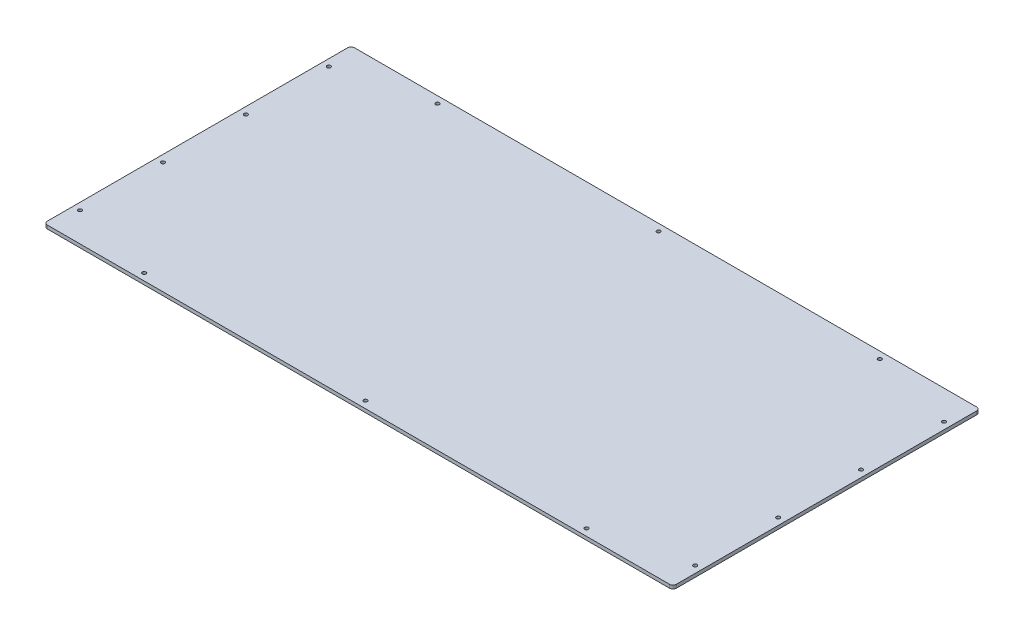
ISO-10303-21;
HEADER;
FILE_DESCRIPTION(('STEP AP214'),'2;1');
FILE_NAME('part.step','',(''),(''),'','','');
FILE_SCHEMA(('AUTOMOTIVE_DESIGN { 1 0 10303 214 1 1 1 1 }'));
ENDSEC;
DATA;
#1=APPLICATION_CONTEXT('core data for automotive mechanical design processes');
#2=APPLICATION_PROTOCOL_DEFINITION('international standard','automotive_design',2000,#1);
#3=PRODUCT_CONTEXT('',#1,'mechanical');
#4=PRODUCT('Part','Part','',(#3));
#5=PRODUCT_RELATED_PRODUCT_CATEGORY('part','',(#4));
#6=PRODUCT_DEFINITION_FORMATION('','',#4);
#7=PRODUCT_DEFINITION_CONTEXT('part definition',#1,'design');
#8=PRODUCT_DEFINITION('design','',#6,#7);
#9=PRODUCT_DEFINITION_SHAPE('','',#8);
#10=(LENGTH_UNIT() NAMED_UNIT(*) SI_UNIT(.MILLI.,.METRE.));
#11=(NAMED_UNIT(*) PLANE_ANGLE_UNIT() SI_UNIT($,.RADIAN.));
#12=(NAMED_UNIT(*) SI_UNIT($,.STERADIAN.) SOLID_ANGLE_UNIT());
#13=UNCERTAINTY_MEASURE_WITH_UNIT(LENGTH_MEASURE(1.E-05),#10,'distance_accuracy_value','');
#14=(GEOMETRIC_REPRESENTATION_CONTEXT(3) GLOBAL_UNCERTAINTY_ASSIGNED_CONTEXT((#13)) GLOBAL_UNIT_ASSIGNED_CONTEXT((#10,
#11,#12)) REPRESENTATION_CONTEXT('',''));
#15=CARTESIAN_POINT('',(0.,0.,0.));
#16=DIRECTION('',(0.,0.,1.));
#17=DIRECTION('',(1.,0.,0.));
#18=AXIS2_PLACEMENT_3D('',#15,#16,#17);
#19=CARTESIAN_POINT('',(577.85,6.35,282.13304));
#20=DIRECTION('',(-1.,0.,0.));
#21=DIRECTION('',(0.,0.,1.));
#22=AXIS2_PLACEMENT_3D('',#19,#20,#21);
#23=PLANE('',#22);
#24=DIRECTION('',(0.,0.,-1.));
#25=VECTOR('',#24,1.);
#26=CARTESIAN_POINT('',(577.85,6.35,282.13304));
#27=LINE('',#26,#25);
#28=CARTESIAN_POINT('',(577.85,6.35,275.78304));
#29=VERTEX_POINT('',#28);
#30=CARTESIAN_POINT('',(577.85,6.35,-275.78304));
#31=VERTEX_POINT('',#30);
#32=EDGE_CURVE('E124',#29,#31,#27,.T.);
#33=ORIENTED_EDGE('',*,*,#32,.F.);
#34=DIRECTION('',(0.,-1.,0.));
#35=VECTOR('',#34,1.);
#36=CARTESIAN_POINT('',(577.85,6.35,275.78304));
#37=LINE('',#36,#35);
#38=CARTESIAN_POINT('',(577.85,0.,275.78304));
#39=VERTEX_POINT('',#38);
#40=EDGE_CURVE('E108',#29,#39,#37,.T.);
#41=ORIENTED_EDGE('',*,*,#40,.T.);
#42=DIRECTION('',(0.,0.,-1.));
#43=VECTOR('',#42,1.);
#44=CARTESIAN_POINT('',(577.85,0.,282.13304));
#45=LINE('',#44,#43);
#46=CARTESIAN_POINT('',(577.85,0.,-275.78304));
#47=VERTEX_POINT('',#46);
#48=EDGE_CURVE('E121',#39,#47,#45,.T.);
#49=ORIENTED_EDGE('',*,*,#48,.T.);
#50=DIRECTION('',(0.,-1.,0.));
#51=VECTOR('',#50,1.);
#52=CARTESIAN_POINT('',(577.85,6.35,-275.78304));
#53=LINE('',#52,#51);
#54=EDGE_CURVE('E127',#47,#31,#53,.F.);
#55=ORIENTED_EDGE('',*,*,#54,.T.);
#56=EDGE_LOOP('',(#33,#41,#49,#55));
#57=FACE_BOUND('',#56,.T.);
#58=ADVANCED_FACE('F38',(#57),#23,.F.);
#59=CARTESIAN_POINT('',(-577.85,6.35,-282.13304));
#60=DIRECTION('',(0.,0.,1.));
#61=DIRECTION('',(1.,0.,0.));
#62=AXIS2_PLACEMENT_3D('',#59,#60,#61);
#63=PLANE('',#62);
#64=DIRECTION('',(-1.,0.,0.));
#65=VECTOR('',#64,1.);
#66=CARTESIAN_POINT('',(-577.85,6.35,-282.13304));
#67=LINE('',#66,#65);
#68=CARTESIAN_POINT('',(571.5,6.35,-282.13304));
#69=VERTEX_POINT('',#68);
#70=CARTESIAN_POINT('',(-571.5,6.35,-282.13304));
#71=VERTEX_POINT('',#70);
#72=EDGE_CURVE('E203',#69,#71,#67,.T.);
#73=ORIENTED_EDGE('',*,*,#72,.F.);
#74=DIRECTION('',(0.,-1.,0.));
#75=VECTOR('',#74,1.);
#76=CARTESIAN_POINT('',(571.5,6.35,-282.13304));
#77=LINE('',#76,#75);
#78=CARTESIAN_POINT('',(571.5,0.,-282.13304));
#79=VERTEX_POINT('',#78);
#80=EDGE_CURVE('E181',#69,#79,#77,.T.);
#81=ORIENTED_EDGE('',*,*,#80,.T.);
#82=DIRECTION('',(-1.,0.,0.));
#83=VECTOR('',#82,1.);
#84=CARTESIAN_POINT('',(-577.85,0.,-282.13304));
#85=LINE('',#84,#83);
#86=CARTESIAN_POINT('',(-571.5,0.,-282.13304));
#87=VERTEX_POINT('',#86);
#88=EDGE_CURVE('E132',#79,#87,#85,.T.);
#89=ORIENTED_EDGE('',*,*,#88,.T.);
#90=DIRECTION('',(0.,-1.,0.));
#91=VECTOR('',#90,1.);
#92=CARTESIAN_POINT('',(-571.5,6.35,-282.13304));
#93=LINE('',#92,#91);
#94=EDGE_CURVE('E178',#87,#71,#93,.F.);
#95=ORIENTED_EDGE('',*,*,#94,.T.);
#96=EDGE_LOOP('',(#73,#81,#89,#95));
#97=FACE_BOUND('',#96,.T.);
#98=ADVANCED_FACE('F365',(#97),#63,.F.);
#99=CARTESIAN_POINT('',(-577.85,6.35,282.13304));
#100=DIRECTION('',(1.,0.,0.));
#101=DIRECTION('',(0.,0.,-1.));
#102=AXIS2_PLACEMENT_3D('',#99,#100,#101);
#103=PLANE('',#102);
#104=DIRECTION('',(0.,0.,1.));
#105=VECTOR('',#104,1.);
#106=CARTESIAN_POINT('',(-577.85,0.,282.13304));
#107=LINE('',#106,#105);
#108=CARTESIAN_POINT('',(-577.85,0.,-275.78304));
#109=VERTEX_POINT('',#108);
#110=CARTESIAN_POINT('',(-577.85,0.,275.78304));
#111=VERTEX_POINT('',#110);
#112=EDGE_CURVE('E139',#109,#111,#107,.T.);
#113=ORIENTED_EDGE('',*,*,#112,.T.);
#114=DIRECTION('',(0.,-1.,0.));
#115=VECTOR('',#114,1.);
#116=CARTESIAN_POINT('',(-577.85,6.35,275.78304));
#117=LINE('',#116,#115);
#118=CARTESIAN_POINT('',(-577.85,6.35,275.78304));
#119=VERTEX_POINT('',#118);
#120=EDGE_CURVE('E11',#111,#119,#117,.F.);
#121=ORIENTED_EDGE('',*,*,#120,.T.);
#122=DIRECTION('',(0.,0.,1.));
#123=VECTOR('',#122,1.);
#124=CARTESIAN_POINT('',(-577.85,6.35,282.13304));
#125=LINE('',#124,#123);
#126=CARTESIAN_POINT('',(-577.85,6.35,-275.78304));
#127=VERTEX_POINT('',#126);
#128=EDGE_CURVE('E190',#127,#119,#125,.T.);
#129=ORIENTED_EDGE('',*,*,#128,.F.);
#130=DIRECTION('',(0.,-1.,0.));
#131=VECTOR('',#130,1.);
#132=CARTESIAN_POINT('',(-577.85,6.35,-275.78304));
#133=LINE('',#132,#131);
#134=EDGE_CURVE('E47',#127,#109,#133,.T.);
#135=ORIENTED_EDGE('',*,*,#134,.T.);
#136=EDGE_LOOP('',(#113,#121,#129,#135));
#137=FACE_BOUND('',#136,.T.);
#138=ADVANCED_FACE('F189',(#137),#103,.F.);
#139=CARTESIAN_POINT('',(-577.85,6.35,282.13304));
#140=DIRECTION('',(0.,0.,-1.));
#141=DIRECTION('',(-1.,0.,0.));
#142=AXIS2_PLACEMENT_3D('',#139,#140,#141);
#143=PLANE('',#142);
#144=DIRECTION('',(1.,0.,0.));
#145=VECTOR('',#144,1.);
#146=CARTESIAN_POINT('',(-577.85,0.,282.13304));
#147=LINE('',#146,#145);
#148=CARTESIAN_POINT('',(-571.5,0.,282.13304));
#149=VERTEX_POINT('',#148);
#150=CARTESIAN_POINT('',(571.5,0.,282.13304));
#151=VERTEX_POINT('',#150);
#152=EDGE_CURVE('E150',#149,#151,#147,.T.);
#153=ORIENTED_EDGE('',*,*,#152,.T.);
#154=DIRECTION('',(0.,-1.,0.));
#155=VECTOR('',#154,1.);
#156=CARTESIAN_POINT('',(571.5,6.35,282.13304));
#157=LINE('',#156,#155);
#158=CARTESIAN_POINT('',(571.5,6.35,282.13304));
#159=VERTEX_POINT('',#158);
#160=EDGE_CURVE('E109',#151,#159,#157,.F.);
#161=ORIENTED_EDGE('',*,*,#160,.T.);
#162=DIRECTION('',(1.,0.,0.));
#163=VECTOR('',#162,1.);
#164=CARTESIAN_POINT('',(-577.85,6.35,282.13304));
#165=LINE('',#164,#163);
#166=CARTESIAN_POINT('',(-571.5,6.35,282.13304));
#167=VERTEX_POINT('',#166);
#168=EDGE_CURVE('E145',#167,#159,#165,.T.);
#169=ORIENTED_EDGE('',*,*,#168,.F.);
#170=DIRECTION('',(0.,-1.,0.));
#171=VECTOR('',#170,1.);
#172=CARTESIAN_POINT('',(-571.5,6.35,282.13304));
#173=LINE('',#172,#171);
#174=EDGE_CURVE('E115',#167,#149,#173,.T.);
#175=ORIENTED_EDGE('',*,*,#174,.T.);
#176=EDGE_LOOP('',(#153,#161,#169,#175));
#177=FACE_BOUND('',#176,.T.);
#178=ADVANCED_FACE('F198',(#177),#143,.F.);
#179=CARTESIAN_POINT('',(0.,6.35,0.));
#180=DIRECTION('',(0.,-1.,0.));
#181=DIRECTION('',(0.,0.,-1.));
#182=AXIS2_PLACEMENT_3D('',#179,#180,#181);
#183=PLANE('',#182);
#184=CARTESIAN_POINT('',(-565.15,6.35,-228.6));
#185=DIRECTION('',(0.,1.,0.));
#186=DIRECTION('',(0.,0.,1.));
#187=AXIS2_PLACEMENT_3D('',#184,#185,#186);
#188=CIRCLE('',#187,3.373501);
#189=CARTESIAN_POINT('',(-565.15,6.35,-225.226499));
#190=VERTEX_POINT('',#189);
#191=EDGE_CURVE('E313',#190,#190,#188,.T.);
#192=ORIENTED_EDGE('',*,*,#191,.F.);
#193=EDGE_LOOP('',(#192));
#194=FACE_BOUND('',#193,.T.);
#195=CARTESIAN_POINT('',(-565.15,6.35,-76.2));
#196=DIRECTION('',(0.,1.,0.));
#197=DIRECTION('',(0.,0.,1.));
#198=AXIS2_PLACEMENT_3D('',#195,#196,#197);
#199=CIRCLE('',#198,3.373501);
#200=CARTESIAN_POINT('',(-565.15,6.35,-72.826499));
#201=VERTEX_POINT('',#200);
#202=EDGE_CURVE('E305',#201,#201,#199,.T.);
#203=ORIENTED_EDGE('',*,*,#202,.F.);
#204=EDGE_LOOP('',(#203));
#205=FACE_BOUND('',#204,.T.);
#206=CARTESIAN_POINT('',(-565.15,6.35,76.2));
#207=DIRECTION('',(0.,1.,0.));
#208=DIRECTION('',(0.,0.,1.));
#209=AXIS2_PLACEMENT_3D('',#206,#207,#208);
#210=CIRCLE('',#209,3.373501);
#211=CARTESIAN_POINT('',(-565.15,6.35,79.573501));
#212=VERTEX_POINT('',#211);
#213=EDGE_CURVE('E297',#212,#212,#210,.T.);
#214=ORIENTED_EDGE('',*,*,#213,.F.);
#215=EDGE_LOOP('',(#214));
#216=FACE_BOUND('',#215,.T.);
#217=CARTESIAN_POINT('',(-565.15,6.35,228.6));
#218=DIRECTION('',(0.,1.,0.));
#219=DIRECTION('',(0.,0.,1.));
#220=AXIS2_PLACEMENT_3D('',#217,#218,#219);
#221=CIRCLE('',#220,3.373501);
#222=CARTESIAN_POINT('',(-565.15,6.35,231.973501));
#223=VERTEX_POINT('',#222);
#224=EDGE_CURVE('E289',#223,#223,#221,.T.);
#225=ORIENTED_EDGE('',*,*,#224,.F.);
#226=EDGE_LOOP('',(#225));
#227=FACE_BOUND('',#226,.T.);
#228=CARTESIAN_POINT('',(565.15,6.35,-228.6));
#229=DIRECTION('',(0.,1.,0.));
#230=DIRECTION('',(0.,0.,1.));
#231=AXIS2_PLACEMENT_3D('',#228,#229,#230);
#232=CIRCLE('',#231,3.373501);
#233=CARTESIAN_POINT('',(565.15,6.35,-225.226499));
#234=VERTEX_POINT('',#233);
#235=EDGE_CURVE('E281',#234,#234,#232,.T.);
#236=ORIENTED_EDGE('',*,*,#235,.F.);
#237=EDGE_LOOP('',(#236));
#238=FACE_BOUND('',#237,.T.);
#239=CARTESIAN_POINT('',(565.15,6.35,-76.2));
#240=DIRECTION('',(0.,1.,0.));
#241=DIRECTION('',(0.,0.,1.));
#242=AXIS2_PLACEMENT_3D('',#239,#240,#241);
#243=CIRCLE('',#242,3.373501);
#244=CARTESIAN_POINT('',(565.15,6.35,-72.826499));
#245=VERTEX_POINT('',#244);
#246=EDGE_CURVE('E273',#245,#245,#243,.T.);
#247=ORIENTED_EDGE('',*,*,#246,.F.);
#248=EDGE_LOOP('',(#247));
#249=FACE_BOUND('',#248,.T.);
#250=CARTESIAN_POINT('',(565.15,6.35,76.2));
#251=DIRECTION('',(0.,1.,0.));
#252=DIRECTION('',(0.,0.,1.));
#253=AXIS2_PLACEMENT_3D('',#250,#251,#252);
#254=CIRCLE('',#253,3.373501);
#255=CARTESIAN_POINT('',(565.15,6.35,79.573501));
#256=VERTEX_POINT('',#255);
#257=EDGE_CURVE('E265',#256,#256,#254,.T.);
#258=ORIENTED_EDGE('',*,*,#257,.F.);
#259=EDGE_LOOP('',(#258));
#260=FACE_BOUND('',#259,.T.);
#261=CARTESIAN_POINT('',(565.15,6.35,228.6));
#262=DIRECTION('',(0.,1.,0.));
#263=DIRECTION('',(0.,0.,1.));
#264=AXIS2_PLACEMENT_3D('',#261,#262,#263);
#265=CIRCLE('',#264,3.373501);
#266=CARTESIAN_POINT('',(565.15,6.35,231.973501));
#267=VERTEX_POINT('',#266);
#268=EDGE_CURVE('E257',#267,#267,#265,.T.);
#269=ORIENTED_EDGE('',*,*,#268,.F.);
#270=EDGE_LOOP('',(#269));
#271=FACE_BOUND('',#270,.T.);
#272=CARTESIAN_POINT('',(-406.4,6.35,-269.43304));
#273=DIRECTION('',(0.,1.,0.));
#274=DIRECTION('',(0.,0.,1.));
#275=AXIS2_PLACEMENT_3D('',#272,#273,#274);
#276=CIRCLE('',#275,3.373501);
#277=CARTESIAN_POINT('',(-406.4,6.35,-266.059539));
#278=VERTEX_POINT('',#277);
#279=EDGE_CURVE('E249',#278,#278,#276,.T.);
#280=ORIENTED_EDGE('',*,*,#279,.F.);
#281=EDGE_LOOP('',(#280));
#282=FACE_BOUND('',#281,.T.);
#283=CARTESIAN_POINT('',(0.,6.35,-269.43304));
#284=DIRECTION('',(0.,1.,0.));
#285=DIRECTION('',(0.,0.,1.));
#286=AXIS2_PLACEMENT_3D('',#283,#284,#285);
#287=CIRCLE('',#286,3.37350099999999);
#288=CARTESIAN_POINT('',(0.,6.35,-266.059539));
#289=VERTEX_POINT('',#288);
#290=EDGE_CURVE('E241',#289,#289,#287,.T.);
#291=ORIENTED_EDGE('',*,*,#290,.F.);
#292=EDGE_LOOP('',(#291));
#293=FACE_BOUND('',#292,.T.);
#294=CARTESIAN_POINT('',(406.4,6.35,-269.43304));
#295=DIRECTION('',(0.,1.,0.));
#296=DIRECTION('',(0.,0.,1.));
#297=AXIS2_PLACEMENT_3D('',#294,#295,#296);
#298=CIRCLE('',#297,3.373501);
#299=CARTESIAN_POINT('',(406.4,6.35,-266.059539));
#300=VERTEX_POINT('',#299);
#301=EDGE_CURVE('E233',#300,#300,#298,.T.);
#302=ORIENTED_EDGE('',*,*,#301,.F.);
#303=EDGE_LOOP('',(#302));
#304=FACE_BOUND('',#303,.T.);
#305=CARTESIAN_POINT('',(406.4,6.35,269.43304));
#306=DIRECTION('',(0.,1.,0.));
#307=DIRECTION('',(0.,0.,1.));
#308=AXIS2_PLACEMENT_3D('',#305,#306,#307);
#309=CIRCLE('',#308,3.373501);
#310=CARTESIAN_POINT('',(406.4,6.35,272.806541));
#311=VERTEX_POINT('',#310);
#312=EDGE_CURVE('E225',#311,#311,#309,.T.);
#313=ORIENTED_EDGE('',*,*,#312,.F.);
#314=EDGE_LOOP('',(#313));
#315=FACE_BOUND('',#314,.T.);
#316=CARTESIAN_POINT('',(0.,6.35,269.43304));
#317=DIRECTION('',(0.,1.,0.));
#318=DIRECTION('',(0.,0.,1.));
#319=AXIS2_PLACEMENT_3D('',#316,#317,#318);
#320=CIRCLE('',#319,3.37350099999999);
#321=CARTESIAN_POINT('',(0.,6.35,272.806541));
#322=VERTEX_POINT('',#321);
#323=EDGE_CURVE('E217',#322,#322,#320,.T.);
#324=ORIENTED_EDGE('',*,*,#323,.F.);
#325=EDGE_LOOP('',(#324));
#326=FACE_BOUND('',#325,.T.);
#327=CARTESIAN_POINT('',(-406.4,6.35,269.43304));
#328=DIRECTION('',(0.,1.,0.));
#329=DIRECTION('',(0.,0.,1.));
#330=AXIS2_PLACEMENT_3D('',#327,#328,#329);
#331=CIRCLE('',#330,3.373501);
#332=CARTESIAN_POINT('',(-406.4,6.35,272.806541));
#333=VERTEX_POINT('',#332);
#334=EDGE_CURVE('E142',#333,#333,#331,.T.);
#335=ORIENTED_EDGE('',*,*,#334,.F.);
#336=EDGE_LOOP('',(#335));
#337=FACE_BOUND('',#336,.T.);
#338=ORIENTED_EDGE('',*,*,#168,.T.);
#339=CARTESIAN_POINT('',(571.5,6.35,275.78304));
#340=DIRECTION('',(0.,-1.,0.));
#341=DIRECTION('',(0.,0.,-1.));
#342=AXIS2_PLACEMENT_3D('',#339,#340,#341);
#343=CIRCLE('',#342,6.35);
#344=EDGE_CURVE('E175',#159,#29,#343,.F.);
#345=ORIENTED_EDGE('',*,*,#344,.T.);
#346=ORIENTED_EDGE('',*,*,#32,.T.);
#347=CARTESIAN_POINT('',(571.5,6.35,-275.78304));
#348=DIRECTION('',(0.,-1.,0.));
#349=DIRECTION('',(0.,0.,-1.));
#350=AXIS2_PLACEMENT_3D('',#347,#348,#349);
#351=CIRCLE('',#350,6.35);
#352=EDGE_CURVE('E172',#31,#69,#351,.F.);
#353=ORIENTED_EDGE('',*,*,#352,.T.);
#354=ORIENTED_EDGE('',*,*,#72,.T.);
#355=CARTESIAN_POINT('',(-571.5,6.35,-275.78304));
#356=DIRECTION('',(0.,-1.,0.));
#357=DIRECTION('',(0.,0.,-1.));
#358=AXIS2_PLACEMENT_3D('',#355,#356,#357);
#359=CIRCLE('',#358,6.35);
#360=EDGE_CURVE('E59',#71,#127,#359,.F.);
#361=ORIENTED_EDGE('',*,*,#360,.T.);
#362=ORIENTED_EDGE('',*,*,#128,.T.);
#363=CARTESIAN_POINT('',(-571.5,6.35,275.78304));
#364=DIRECTION('',(0.,-1.,0.));
#365=DIRECTION('',(0.,0.,-1.));
#366=AXIS2_PLACEMENT_3D('',#363,#364,#365);
#367=CIRCLE('',#366,6.35);
#368=EDGE_CURVE('E169',#119,#167,#367,.F.);
#369=ORIENTED_EDGE('',*,*,#368,.T.);
#370=EDGE_LOOP('',(#338,#345,#346,#353,#354,#361,#362,#369));
#371=FACE_BOUND('',#370,.T.);
#372=ADVANCED_FACE('F321',(#194,#205,#216,#227,#238,#249,#260,#271,#282,#293,#304,#315,#326,
#337,#371),#183,.F.);
#373=CARTESIAN_POINT('',(0.,0.,0.));
#374=DIRECTION('',(0.,-1.,0.));
#375=DIRECTION('',(0.,0.,-1.));
#376=AXIS2_PLACEMENT_3D('',#373,#374,#375);
#377=PLANE('',#376);
#378=CARTESIAN_POINT('',(-565.15,0.,-228.6));
#379=DIRECTION('',(0.,1.,0.));
#380=DIRECTION('',(0.,0.,1.));
#381=AXIS2_PLACEMENT_3D('',#378,#379,#380);
#382=CIRCLE('',#381,3.373501);
#383=CARTESIAN_POINT('',(-565.15,0.,-225.226499));
#384=VERTEX_POINT('',#383);
#385=EDGE_CURVE('E309',#384,#384,#382,.T.);
#386=ORIENTED_EDGE('',*,*,#385,.T.);
#387=EDGE_LOOP('',(#386));
#388=FACE_BOUND('',#387,.T.);
#389=CARTESIAN_POINT('',(-565.15,0.,-76.2));
#390=DIRECTION('',(0.,1.,0.));
#391=DIRECTION('',(0.,0.,1.));
#392=AXIS2_PLACEMENT_3D('',#389,#390,#391);
#393=CIRCLE('',#392,3.373501);
#394=CARTESIAN_POINT('',(-565.15,0.,-72.826499));
#395=VERTEX_POINT('',#394);
#396=EDGE_CURVE('E301',#395,#395,#393,.T.);
#397=ORIENTED_EDGE('',*,*,#396,.T.);
#398=EDGE_LOOP('',(#397));
#399=FACE_BOUND('',#398,.T.);
#400=CARTESIAN_POINT('',(-565.15,0.,76.2));
#401=DIRECTION('',(0.,1.,0.));
#402=DIRECTION('',(0.,0.,1.));
#403=AXIS2_PLACEMENT_3D('',#400,#401,#402);
#404=CIRCLE('',#403,3.373501);
#405=CARTESIAN_POINT('',(-565.15,0.,79.573501));
#406=VERTEX_POINT('',#405);
#407=EDGE_CURVE('E293',#406,#406,#404,.T.);
#408=ORIENTED_EDGE('',*,*,#407,.T.);
#409=EDGE_LOOP('',(#408));
#410=FACE_BOUND('',#409,.T.);
#411=CARTESIAN_POINT('',(-565.15,0.,228.6));
#412=DIRECTION('',(0.,1.,0.));
#413=DIRECTION('',(0.,0.,1.));
#414=AXIS2_PLACEMENT_3D('',#411,#412,#413);
#415=CIRCLE('',#414,3.373501);
#416=CARTESIAN_POINT('',(-565.15,0.,231.973501));
#417=VERTEX_POINT('',#416);
#418=EDGE_CURVE('E285',#417,#417,#415,.T.);
#419=ORIENTED_EDGE('',*,*,#418,.T.);
#420=EDGE_LOOP('',(#419));
#421=FACE_BOUND('',#420,.T.);
#422=CARTESIAN_POINT('',(565.15,0.,-228.6));
#423=DIRECTION('',(0.,1.,0.));
#424=DIRECTION('',(0.,0.,1.));
#425=AXIS2_PLACEMENT_3D('',#422,#423,#424);
#426=CIRCLE('',#425,3.373501);
#427=CARTESIAN_POINT('',(565.15,0.,-225.226499));
#428=VERTEX_POINT('',#427);
#429=EDGE_CURVE('E277',#428,#428,#426,.T.);
#430=ORIENTED_EDGE('',*,*,#429,.T.);
#431=EDGE_LOOP('',(#430));
#432=FACE_BOUND('',#431,.T.);
#433=CARTESIAN_POINT('',(565.15,0.,-76.2));
#434=DIRECTION('',(0.,1.,0.));
#435=DIRECTION('',(0.,0.,1.));
#436=AXIS2_PLACEMENT_3D('',#433,#434,#435);
#437=CIRCLE('',#436,3.373501);
#438=CARTESIAN_POINT('',(565.15,0.,-72.826499));
#439=VERTEX_POINT('',#438);
#440=EDGE_CURVE('E269',#439,#439,#437,.T.);
#441=ORIENTED_EDGE('',*,*,#440,.T.);
#442=EDGE_LOOP('',(#441));
#443=FACE_BOUND('',#442,.T.);
#444=CARTESIAN_POINT('',(565.15,0.,76.2));
#445=DIRECTION('',(0.,1.,0.));
#446=DIRECTION('',(0.,0.,1.));
#447=AXIS2_PLACEMENT_3D('',#444,#445,#446);
#448=CIRCLE('',#447,3.373501);
#449=CARTESIAN_POINT('',(565.15,0.,79.573501));
#450=VERTEX_POINT('',#449);
#451=EDGE_CURVE('E261',#450,#450,#448,.T.);
#452=ORIENTED_EDGE('',*,*,#451,.T.);
#453=EDGE_LOOP('',(#452));
#454=FACE_BOUND('',#453,.T.);
#455=CARTESIAN_POINT('',(565.15,0.,228.6));
#456=DIRECTION('',(0.,1.,0.));
#457=DIRECTION('',(0.,0.,1.));
#458=AXIS2_PLACEMENT_3D('',#455,#456,#457);
#459=CIRCLE('',#458,3.373501);
#460=CARTESIAN_POINT('',(565.15,0.,231.973501));
#461=VERTEX_POINT('',#460);
#462=EDGE_CURVE('E253',#461,#461,#459,.T.);
#463=ORIENTED_EDGE('',*,*,#462,.T.);
#464=EDGE_LOOP('',(#463));
#465=FACE_BOUND('',#464,.T.);
#466=CARTESIAN_POINT('',(-406.4,0.,-269.43304));
#467=DIRECTION('',(0.,1.,0.));
#468=DIRECTION('',(0.,0.,1.));
#469=AXIS2_PLACEMENT_3D('',#466,#467,#468);
#470=CIRCLE('',#469,3.373501);
#471=CARTESIAN_POINT('',(-406.4,0.,-266.059539));
#472=VERTEX_POINT('',#471);
#473=EDGE_CURVE('E245',#472,#472,#470,.T.);
#474=ORIENTED_EDGE('',*,*,#473,.T.);
#475=EDGE_LOOP('',(#474));
#476=FACE_BOUND('',#475,.T.);
#477=CARTESIAN_POINT('',(0.,0.,-269.43304));
#478=DIRECTION('',(0.,1.,0.));
#479=DIRECTION('',(0.,0.,1.));
#480=AXIS2_PLACEMENT_3D('',#477,#478,#479);
#481=CIRCLE('',#480,3.373501);
#482=CARTESIAN_POINT('',(0.,0.,-266.059539));
#483=VERTEX_POINT('',#482);
#484=EDGE_CURVE('E237',#483,#483,#481,.T.);
#485=ORIENTED_EDGE('',*,*,#484,.T.);
#486=EDGE_LOOP('',(#485));
#487=FACE_BOUND('',#486,.T.);
#488=CARTESIAN_POINT('',(406.4,0.,-269.43304));
#489=DIRECTION('',(0.,1.,0.));
#490=DIRECTION('',(0.,0.,1.));
#491=AXIS2_PLACEMENT_3D('',#488,#489,#490);
#492=CIRCLE('',#491,3.373501);
#493=CARTESIAN_POINT('',(406.4,0.,-266.059539));
#494=VERTEX_POINT('',#493);
#495=EDGE_CURVE('E229',#494,#494,#492,.T.);
#496=ORIENTED_EDGE('',*,*,#495,.T.);
#497=EDGE_LOOP('',(#496));
#498=FACE_BOUND('',#497,.T.);
#499=CARTESIAN_POINT('',(406.4,0.,269.43304));
#500=DIRECTION('',(0.,1.,0.));
#501=DIRECTION('',(0.,0.,1.));
#502=AXIS2_PLACEMENT_3D('',#499,#500,#501);
#503=CIRCLE('',#502,3.373501);
#504=CARTESIAN_POINT('',(406.4,0.,272.806541));
#505=VERTEX_POINT('',#504);
#506=EDGE_CURVE('E221',#505,#505,#503,.T.);
#507=ORIENTED_EDGE('',*,*,#506,.T.);
#508=EDGE_LOOP('',(#507));
#509=FACE_BOUND('',#508,.T.);
#510=CARTESIAN_POINT('',(0.,0.,269.43304));
#511=DIRECTION('',(0.,1.,0.));
#512=DIRECTION('',(0.,0.,1.));
#513=AXIS2_PLACEMENT_3D('',#510,#511,#512);
#514=CIRCLE('',#513,3.373501);
#515=CARTESIAN_POINT('',(0.,0.,272.806541));
#516=VERTEX_POINT('',#515);
#517=EDGE_CURVE('E213',#516,#516,#514,.T.);
#518=ORIENTED_EDGE('',*,*,#517,.T.);
#519=EDGE_LOOP('',(#518));
#520=FACE_BOUND('',#519,.T.);
#521=CARTESIAN_POINT('',(-406.4,0.,269.43304));
#522=DIRECTION('',(0.,1.,0.));
#523=DIRECTION('',(0.,0.,1.));
#524=AXIS2_PLACEMENT_3D('',#521,#522,#523);
#525=CIRCLE('',#524,3.373501);
#526=CARTESIAN_POINT('',(-406.4,0.,272.806541));
#527=VERTEX_POINT('',#526);
#528=EDGE_CURVE('E133',#527,#527,#525,.T.);
#529=ORIENTED_EDGE('',*,*,#528,.T.);
#530=EDGE_LOOP('',(#529));
#531=FACE_BOUND('',#530,.T.);
#532=ORIENTED_EDGE('',*,*,#48,.F.);
#533=CARTESIAN_POINT('',(571.5,0.,275.78304));
#534=DIRECTION('',(0.,-1.,0.));
#535=DIRECTION('',(0.,0.,-1.));
#536=AXIS2_PLACEMENT_3D('',#533,#534,#535);
#537=CIRCLE('',#536,6.35);
#538=EDGE_CURVE('E104',#39,#151,#537,.T.);
#539=ORIENTED_EDGE('',*,*,#538,.T.);
#540=ORIENTED_EDGE('',*,*,#152,.F.);
#541=CARTESIAN_POINT('',(-571.5,0.,275.78304));
#542=DIRECTION('',(0.,-1.,0.));
#543=DIRECTION('',(0.,0.,-1.));
#544=AXIS2_PLACEMENT_3D('',#541,#542,#543);
#545=CIRCLE('',#544,6.35);
#546=EDGE_CURVE('E157',#149,#111,#545,.T.);
#547=ORIENTED_EDGE('',*,*,#546,.T.);
#548=ORIENTED_EDGE('',*,*,#112,.F.);
#549=CARTESIAN_POINT('',(-571.5,0.,-275.78304));
#550=DIRECTION('',(0.,-1.,0.));
#551=DIRECTION('',(0.,0.,-1.));
#552=AXIS2_PLACEMENT_3D('',#549,#550,#551);
#553=CIRCLE('',#552,6.35);
#554=EDGE_CURVE('E126',#109,#87,#553,.T.);
#555=ORIENTED_EDGE('',*,*,#554,.T.);
#556=ORIENTED_EDGE('',*,*,#88,.F.);
#557=CARTESIAN_POINT('',(571.5,0.,-275.78304));
#558=DIRECTION('',(0.,-1.,0.));
#559=DIRECTION('',(0.,0.,-1.));
#560=AXIS2_PLACEMENT_3D('',#557,#558,#559);
#561=CIRCLE('',#560,6.35);
#562=EDGE_CURVE('E116',#79,#47,#561,.T.);
#563=ORIENTED_EDGE('',*,*,#562,.T.);
#564=EDGE_LOOP('',(#532,#539,#540,#547,#548,#555,#556,#563));
#565=FACE_BOUND('',#564,.T.);
#566=ADVANCED_FACE('F129',(#388,#399,#410,#421,#432,#443,#454,#465,#476,#487,#498,#509,#520,
#531,#565),#377,.T.);
#567=CARTESIAN_POINT('',(571.5,6.35,275.78304));
#568=DIRECTION('',(0.,-1.,0.));
#569=DIRECTION('',(0.,0.,-1.));
#570=AXIS2_PLACEMENT_3D('',#567,#568,#569);
#571=CYLINDRICAL_SURFACE('',#570,6.35);
#572=ORIENTED_EDGE('',*,*,#344,.F.);
#573=ORIENTED_EDGE('',*,*,#160,.F.);
#574=ORIENTED_EDGE('',*,*,#538,.F.);
#575=ORIENTED_EDGE('',*,*,#40,.F.);
#576=EDGE_LOOP('',(#572,#573,#574,#575));
#577=FACE_BOUND('',#576,.T.);
#578=ADVANCED_FACE('F107',(#577),#571,.T.);
#579=CARTESIAN_POINT('',(571.5,6.35,-275.78304));
#580=DIRECTION('',(0.,-1.,0.));
#581=DIRECTION('',(0.,0.,-1.));
#582=AXIS2_PLACEMENT_3D('',#579,#580,#581);
#583=CYLINDRICAL_SURFACE('',#582,6.35);
#584=ORIENTED_EDGE('',*,*,#352,.F.);
#585=ORIENTED_EDGE('',*,*,#54,.F.);
#586=ORIENTED_EDGE('',*,*,#562,.F.);
#587=ORIENTED_EDGE('',*,*,#80,.F.);
#588=EDGE_LOOP('',(#584,#585,#586,#587));
#589=FACE_BOUND('',#588,.T.);
#590=ADVANCED_FACE('F376',(#589),#583,.T.);
#591=CARTESIAN_POINT('',(-571.5,6.35,275.78304));
#592=DIRECTION('',(0.,-1.,0.));
#593=DIRECTION('',(0.,0.,-1.));
#594=AXIS2_PLACEMENT_3D('',#591,#592,#593);
#595=CYLINDRICAL_SURFACE('',#594,6.35);
#596=ORIENTED_EDGE('',*,*,#368,.F.);
#597=ORIENTED_EDGE('',*,*,#120,.F.);
#598=ORIENTED_EDGE('',*,*,#546,.F.);
#599=ORIENTED_EDGE('',*,*,#174,.F.);
#600=EDGE_LOOP('',(#596,#597,#598,#599));
#601=FACE_BOUND('',#600,.T.);
#602=ADVANCED_FACE('F195',(#601),#595,.T.);
#603=CARTESIAN_POINT('',(-571.5,6.35,-275.78304));
#604=DIRECTION('',(0.,-1.,0.));
#605=DIRECTION('',(0.,0.,-1.));
#606=AXIS2_PLACEMENT_3D('',#603,#604,#605);
#607=CYLINDRICAL_SURFACE('',#606,6.35);
#608=ORIENTED_EDGE('',*,*,#360,.F.);
#609=ORIENTED_EDGE('',*,*,#94,.F.);
#610=ORIENTED_EDGE('',*,*,#554,.F.);
#611=ORIENTED_EDGE('',*,*,#134,.F.);
#612=EDGE_LOOP('',(#608,#609,#610,#611));
#613=FACE_BOUND('',#612,.T.);
#614=ADVANCED_FACE('F40',(#613),#607,.T.);
#615=CARTESIAN_POINT('',(-406.4,6.35,269.43304));
#616=DIRECTION('',(0.,1.,0.));
#617=DIRECTION('',(0.,0.,1.));
#618=AXIS2_PLACEMENT_3D('',#615,#616,#617);
#619=CYLINDRICAL_SURFACE('',#618,3.373501);
#620=ORIENTED_EDGE('',*,*,#528,.F.);
#621=EDGE_LOOP('',(#620));
#622=FACE_BOUND('',#621,.T.);
#623=ORIENTED_EDGE('',*,*,#334,.T.);
#624=EDGE_LOOP('',(#623));
#625=FACE_BOUND('',#624,.T.);
#626=ADVANCED_FACE('F351',(#622,#625),#619,.F.);
#627=CARTESIAN_POINT('',(0.,6.35,269.43304));
#628=DIRECTION('',(0.,1.,0.));
#629=DIRECTION('',(0.,0.,1.));
#630=AXIS2_PLACEMENT_3D('',#627,#628,#629);
#631=CYLINDRICAL_SURFACE('',#630,3.37350099999999);
#632=ORIENTED_EDGE('',*,*,#517,.F.);
#633=EDGE_LOOP('',(#632));
#634=FACE_BOUND('',#633,.T.);
#635=ORIENTED_EDGE('',*,*,#323,.T.);
#636=EDGE_LOOP('',(#635));
#637=FACE_BOUND('',#636,.T.);
#638=ADVANCED_FACE('F353',(#634,#637),#631,.F.);
#639=CARTESIAN_POINT('',(406.4,6.35,269.43304));
#640=DIRECTION('',(0.,1.,0.));
#641=DIRECTION('',(0.,0.,1.));
#642=AXIS2_PLACEMENT_3D('',#639,#640,#641);
#643=CYLINDRICAL_SURFACE('',#642,3.373501);
#644=ORIENTED_EDGE('',*,*,#506,.F.);
#645=EDGE_LOOP('',(#644));
#646=FACE_BOUND('',#645,.T.);
#647=ORIENTED_EDGE('',*,*,#312,.T.);
#648=EDGE_LOOP('',(#647));
#649=FACE_BOUND('',#648,.T.);
#650=ADVANCED_FACE('F360',(#646,#649),#643,.F.);
#651=CARTESIAN_POINT('',(406.4,6.35,-269.43304));
#652=DIRECTION('',(0.,1.,0.));
#653=DIRECTION('',(0.,0.,1.));
#654=AXIS2_PLACEMENT_3D('',#651,#652,#653);
#655=CYLINDRICAL_SURFACE('',#654,3.373501);
#656=ORIENTED_EDGE('',*,*,#495,.F.);
#657=EDGE_LOOP('',(#656));
#658=FACE_BOUND('',#657,.T.);
#659=ORIENTED_EDGE('',*,*,#301,.T.);
#660=EDGE_LOOP('',(#659));
#661=FACE_BOUND('',#660,.T.);
#662=ADVANCED_FACE('F409',(#658,#661),#655,.F.);
#663=CARTESIAN_POINT('',(0.,6.35,-269.43304));
#664=DIRECTION('',(0.,1.,0.));
#665=DIRECTION('',(0.,0.,1.));
#666=AXIS2_PLACEMENT_3D('',#663,#664,#665);
#667=CYLINDRICAL_SURFACE('',#666,3.37350099999999);
#668=ORIENTED_EDGE('',*,*,#484,.F.);
#669=EDGE_LOOP('',(#668));
#670=FACE_BOUND('',#669,.T.);
#671=ORIENTED_EDGE('',*,*,#290,.T.);
#672=EDGE_LOOP('',(#671));
#673=FACE_BOUND('',#672,.T.);
#674=ADVANCED_FACE('F419',(#670,#673),#667,.F.);
#675=CARTESIAN_POINT('',(-406.4,6.35,-269.43304));
#676=DIRECTION('',(0.,1.,0.));
#677=DIRECTION('',(0.,0.,1.));
#678=AXIS2_PLACEMENT_3D('',#675,#676,#677);
#679=CYLINDRICAL_SURFACE('',#678,3.373501);
#680=ORIENTED_EDGE('',*,*,#473,.F.);
#681=EDGE_LOOP('',(#680));
#682=FACE_BOUND('',#681,.T.);
#683=ORIENTED_EDGE('',*,*,#279,.T.);
#684=EDGE_LOOP('',(#683));
#685=FACE_BOUND('',#684,.T.);
#686=ADVANCED_FACE('F429',(#682,#685),#679,.F.);
#687=CARTESIAN_POINT('',(565.15,6.35,228.6));
#688=DIRECTION('',(0.,1.,0.));
#689=DIRECTION('',(0.,0.,1.));
#690=AXIS2_PLACEMENT_3D('',#687,#688,#689);
#691=CYLINDRICAL_SURFACE('',#690,3.373501);
#692=ORIENTED_EDGE('',*,*,#462,.F.);
#693=EDGE_LOOP('',(#692));
#694=FACE_BOUND('',#693,.T.);
#695=ORIENTED_EDGE('',*,*,#268,.T.);
#696=EDGE_LOOP('',(#695));
#697=FACE_BOUND('',#696,.T.);
#698=ADVANCED_FACE('F439',(#694,#697),#691,.F.);
#699=CARTESIAN_POINT('',(565.15,6.35,76.2));
#700=DIRECTION('',(0.,1.,0.));
#701=DIRECTION('',(0.,0.,1.));
#702=AXIS2_PLACEMENT_3D('',#699,#700,#701);
#703=CYLINDRICAL_SURFACE('',#702,3.373501);
#704=ORIENTED_EDGE('',*,*,#451,.F.);
#705=EDGE_LOOP('',(#704));
#706=FACE_BOUND('',#705,.T.);
#707=ORIENTED_EDGE('',*,*,#257,.T.);
#708=EDGE_LOOP('',(#707));
#709=FACE_BOUND('',#708,.T.);
#710=ADVANCED_FACE('F449',(#706,#709),#703,.F.);
#711=CARTESIAN_POINT('',(565.15,6.35,-76.2));
#712=DIRECTION('',(0.,1.,0.));
#713=DIRECTION('',(0.,0.,1.));
#714=AXIS2_PLACEMENT_3D('',#711,#712,#713);
#715=CYLINDRICAL_SURFACE('',#714,3.373501);
#716=ORIENTED_EDGE('',*,*,#440,.F.);
#717=EDGE_LOOP('',(#716));
#718=FACE_BOUND('',#717,.T.);
#719=ORIENTED_EDGE('',*,*,#246,.T.);
#720=EDGE_LOOP('',(#719));
#721=FACE_BOUND('',#720,.T.);
#722=ADVANCED_FACE('F459',(#718,#721),#715,.F.);
#723=CARTESIAN_POINT('',(565.15,6.35,-228.6));
#724=DIRECTION('',(0.,1.,0.));
#725=DIRECTION('',(0.,0.,1.));
#726=AXIS2_PLACEMENT_3D('',#723,#724,#725);
#727=CYLINDRICAL_SURFACE('',#726,3.373501);
#728=ORIENTED_EDGE('',*,*,#429,.F.);
#729=EDGE_LOOP('',(#728));
#730=FACE_BOUND('',#729,.T.);
#731=ORIENTED_EDGE('',*,*,#235,.T.);
#732=EDGE_LOOP('',(#731));
#733=FACE_BOUND('',#732,.T.);
#734=ADVANCED_FACE('F469',(#730,#733),#727,.F.);
#735=CARTESIAN_POINT('',(-565.15,6.35,228.6));
#736=DIRECTION('',(0.,1.,0.));
#737=DIRECTION('',(0.,0.,1.));
#738=AXIS2_PLACEMENT_3D('',#735,#736,#737);
#739=CYLINDRICAL_SURFACE('',#738,3.373501);
#740=ORIENTED_EDGE('',*,*,#418,.F.);
#741=EDGE_LOOP('',(#740));
#742=FACE_BOUND('',#741,.T.);
#743=ORIENTED_EDGE('',*,*,#224,.T.);
#744=EDGE_LOOP('',(#743));
#745=FACE_BOUND('',#744,.T.);
#746=ADVANCED_FACE('F479',(#742,#745),#739,.F.);
#747=CARTESIAN_POINT('',(-565.15,6.35,76.2));
#748=DIRECTION('',(0.,1.,0.));
#749=DIRECTION('',(0.,0.,1.));
#750=AXIS2_PLACEMENT_3D('',#747,#748,#749);
#751=CYLINDRICAL_SURFACE('',#750,3.373501);
#752=ORIENTED_EDGE('',*,*,#407,.F.);
#753=EDGE_LOOP('',(#752));
#754=FACE_BOUND('',#753,.T.);
#755=ORIENTED_EDGE('',*,*,#213,.T.);
#756=EDGE_LOOP('',(#755));
#757=FACE_BOUND('',#756,.T.);
#758=ADVANCED_FACE('F489',(#754,#757),#751,.F.);
#759=CARTESIAN_POINT('',(-565.15,6.35,-76.2));
#760=DIRECTION('',(0.,1.,0.));
#761=DIRECTION('',(0.,0.,1.));
#762=AXIS2_PLACEMENT_3D('',#759,#760,#761);
#763=CYLINDRICAL_SURFACE('',#762,3.373501);
#764=ORIENTED_EDGE('',*,*,#396,.F.);
#765=EDGE_LOOP('',(#764));
#766=FACE_BOUND('',#765,.T.);
#767=ORIENTED_EDGE('',*,*,#202,.T.);
#768=EDGE_LOOP('',(#767));
#769=FACE_BOUND('',#768,.T.);
#770=ADVANCED_FACE('F499',(#766,#769),#763,.F.);
#771=CARTESIAN_POINT('',(-565.15,6.35,-228.6));
#772=DIRECTION('',(0.,1.,0.));
#773=DIRECTION('',(0.,0.,1.));
#774=AXIS2_PLACEMENT_3D('',#771,#772,#773);
#775=CYLINDRICAL_SURFACE('',#774,3.373501);
#776=ORIENTED_EDGE('',*,*,#385,.F.);
#777=EDGE_LOOP('',(#776));
#778=FACE_BOUND('',#777,.T.);
#779=ORIENTED_EDGE('',*,*,#191,.T.);
#780=EDGE_LOOP('',(#779));
#781=FACE_BOUND('',#780,.T.);
#782=ADVANCED_FACE('F319',(#778,#781),#775,.F.);
#783=CLOSED_SHELL('',(#58,#98,#138,#178,#372,#566,#578,#590,#602,#614,#626,#638,#650,#662,#674,
#686,#698,#710,#722,#734,#746,#758,#770,#782));
#784=MANIFOLD_SOLID_BREP('B2',#783);
#785=ADVANCED_BREP_SHAPE_REPRESENTATION('',(#18,#784),#14);
#786=SHAPE_DEFINITION_REPRESENTATION(#9,#785);
ENDSEC;
END-ISO-10303-21;
